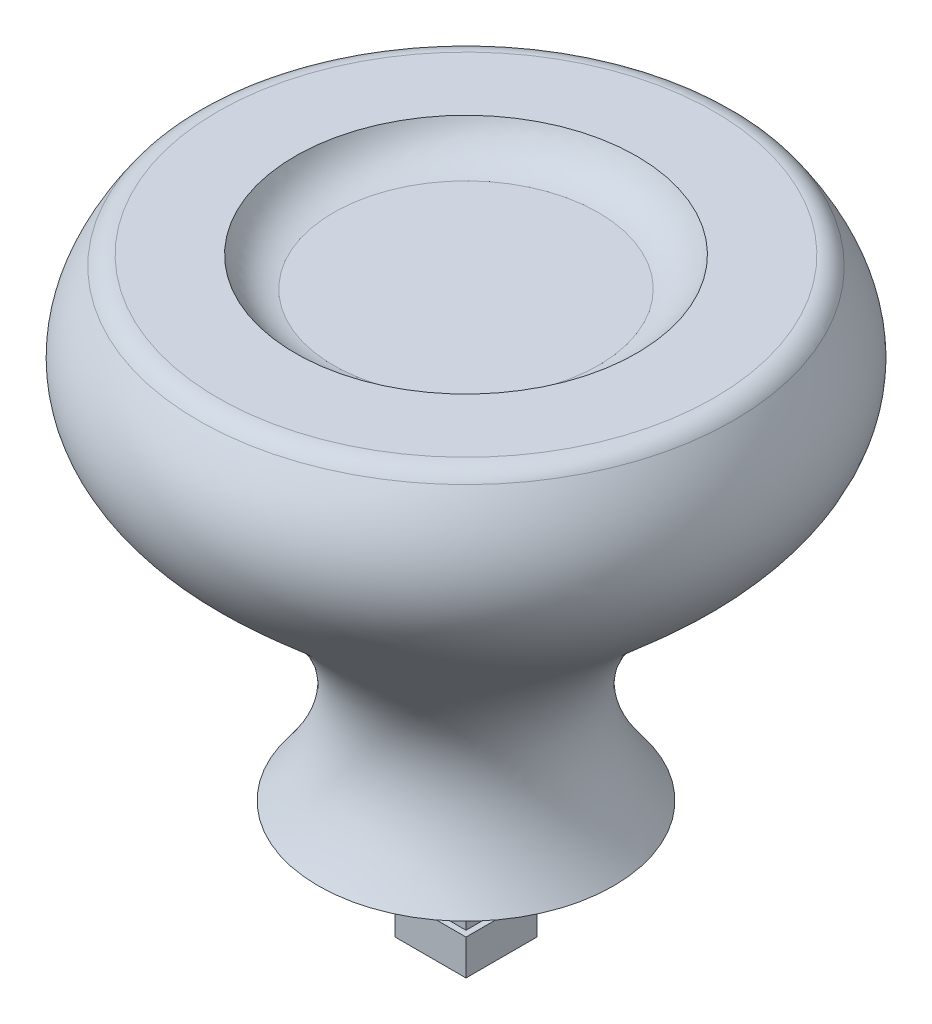
ISO-10303-21;
HEADER;
FILE_DESCRIPTION(('STEP AP214'),'2;1');
FILE_NAME('part.step','',(''),(''),'','','');
FILE_SCHEMA(('AUTOMOTIVE_DESIGN { 1 0 10303 214 1 1 1 1 }'));
ENDSEC;
DATA;
#1=APPLICATION_CONTEXT('core data for automotive mechanical design processes');
#2=APPLICATION_PROTOCOL_DEFINITION('international standard','automotive_design',2000,#1);
#3=PRODUCT_CONTEXT('',#1,'mechanical');
#4=PRODUCT('Part','Part','',(#3));
#5=PRODUCT_RELATED_PRODUCT_CATEGORY('part','',(#4));
#6=PRODUCT_DEFINITION_FORMATION('','',#4);
#7=PRODUCT_DEFINITION_CONTEXT('part definition',#1,'design');
#8=PRODUCT_DEFINITION('design','',#6,#7);
#9=PRODUCT_DEFINITION_SHAPE('','',#8);
#10=(LENGTH_UNIT() NAMED_UNIT(*) SI_UNIT(.MILLI.,.METRE.));
#11=(NAMED_UNIT(*) PLANE_ANGLE_UNIT() SI_UNIT($,.RADIAN.));
#12=(NAMED_UNIT(*) SI_UNIT($,.STERADIAN.) SOLID_ANGLE_UNIT());
#13=UNCERTAINTY_MEASURE_WITH_UNIT(LENGTH_MEASURE(1.E-05),#10,'distance_accuracy_value','');
#14=(GEOMETRIC_REPRESENTATION_CONTEXT(3) GLOBAL_UNCERTAINTY_ASSIGNED_CONTEXT((#13)) GLOBAL_UNIT_ASSIGNED_CONTEXT((#10,
#11,#12)) REPRESENTATION_CONTEXT('',''));
#15=CARTESIAN_POINT('',(0.,0.,0.));
#16=DIRECTION('',(0.,0.,1.));
#17=DIRECTION('',(1.,0.,0.));
#18=AXIS2_PLACEMENT_3D('',#15,#16,#17);
#19=CARTESIAN_POINT('',(0.,0.,0.));
#20=DIRECTION('',(0.,-1.,0.));
#21=DIRECTION('',(1.,0.,0.));
#22=AXIS2_PLACEMENT_3D('',#19,#20,#21);
#23=PLANE('',#22);
#24=DIRECTION('',(0.,0.,1.));
#25=VECTOR('',#24,1.);
#26=CARTESIAN_POINT('',(2.5,0.,2.5));
#27=LINE('',#26,#25);
#28=CARTESIAN_POINT('',(2.5,0.,-2.5));
#29=VERTEX_POINT('',#28);
#30=CARTESIAN_POINT('',(2.5,0.,2.5));
#31=VERTEX_POINT('',#30);
#32=EDGE_CURVE('E175',#29,#31,#27,.T.);
#33=ORIENTED_EDGE('',*,*,#32,.F.);
#34=DIRECTION('',(1.,0.,0.));
#35=VECTOR('',#34,1.);
#36=CARTESIAN_POINT('',(-2.5,0.,-2.5));
#37=LINE('',#36,#35);
#38=CARTESIAN_POINT('',(-2.5,0.,-2.5));
#39=VERTEX_POINT('',#38);
#40=EDGE_CURVE('E186',#39,#29,#37,.T.);
#41=ORIENTED_EDGE('',*,*,#40,.F.);
#42=DIRECTION('',(0.,0.,-1.));
#43=VECTOR('',#42,1.);
#44=CARTESIAN_POINT('',(-2.5,0.,2.5));
#45=LINE('',#44,#43);
#46=CARTESIAN_POINT('',(-2.5,0.,2.5));
#47=VERTEX_POINT('',#46);
#48=EDGE_CURVE('E182',#47,#39,#45,.T.);
#49=ORIENTED_EDGE('',*,*,#48,.F.);
#50=DIRECTION('',(-1.,0.,0.));
#51=VECTOR('',#50,1.);
#52=CARTESIAN_POINT('',(-2.5,0.,2.5));
#53=LINE('',#52,#51);
#54=EDGE_CURVE('E178',#31,#47,#53,.T.);
#55=ORIENTED_EDGE('',*,*,#54,.F.);
#56=EDGE_LOOP('',(#33,#41,#49,#55));
#57=FACE_BOUND('',#56,.T.);
#58=CARTESIAN_POINT('',(0.,0.,0.));
#59=DIRECTION('',(0.,-1.,0.));
#60=DIRECTION('',(1.,0.,0.));
#61=AXIS2_PLACEMENT_3D('',#58,#59,#60);
#62=CIRCLE('',#61,12.5);
#63=CARTESIAN_POINT('',(12.5,0.,0.));
#64=VERTEX_POINT('',#63);
#65=EDGE_CURVE('E231',#64,#64,#62,.T.);
#66=ORIENTED_EDGE('',*,*,#65,.T.);
#67=EDGE_LOOP('',(#66));
#68=FACE_BOUND('',#67,.T.);
#69=ADVANCED_FACE('F45',(#57,#68),#23,.T.);
#70=CARTESIAN_POINT('',(12.5,0.,0.));
#71=CARTESIAN_POINT('',(-2.79299913125608,19.4776406927146,0.));
#72=CARTESIAN_POINT('',(36.0481940970209,21.9036233326718,0.));
#73=CARTESIAN_POINT('',(22.,40.,0.));
#74=B_SPLINE_CURVE_WITH_KNOTS('',3,(#70,#71,#72,#73),.UNSPECIFIED.,.F.,.F.,(4,4),(0.,1.),.UNSPECIFIED.);
#75=CARTESIAN_POINT('',(0.,0.,0.));
#76=DIRECTION('',(0.,-1.,0.));
#77=AXIS1_PLACEMENT('',#75,#76);
#78=SURFACE_OF_REVOLUTION('',#74,#77);
#79=CARTESIAN_POINT('',(0.,39.1514987910332,0.));
#80=DIRECTION('',(0.,-1.,0.));
#81=DIRECTION('',(1.,0.,0.));
#82=AXIS2_PLACEMENT_3D('',#79,#80,#81);
#83=CIRCLE('',#82,22.6283444466604);
#84=CARTESIAN_POINT('',(22.6283444466604,39.1514987910332,0.));
#85=VERTEX_POINT('',#84);
#86=EDGE_CURVE('E238',#85,#85,#83,.T.);
#87=ORIENTED_EDGE('',*,*,#86,.T.);
#88=EDGE_LOOP('',(#87));
#89=FACE_BOUND('',#88,.T.);
#90=ORIENTED_EDGE('',*,*,#65,.F.);
#91=EDGE_LOOP('',(#90));
#92=FACE_BOUND('',#91,.T.);
#93=ADVANCED_FACE('F221',(#89,#92),#78,.F.);
#94=CARTESIAN_POINT('',(0.,40.,0.));
#95=DIRECTION('',(0.,1.,0.));
#96=DIRECTION('',(-1.,0.,0.));
#97=AXIS2_PLACEMENT_3D('',#94,#95,#96);
#98=PLANE('',#97);
#99=CARTESIAN_POINT('',(0.,40.,0.));
#100=DIRECTION('',(0.,1.,0.));
#101=DIRECTION('',(-1.,0.,0.));
#102=AXIS2_PLACEMENT_3D('',#99,#100,#101);
#103=CIRCLE('',#102,20.9930920091912);
#104=CARTESIAN_POINT('',(-20.9930920091912,40.,0.));
#105=VERTEX_POINT('',#104);
#106=EDGE_CURVE('E54',#105,#105,#103,.T.);
#107=ORIENTED_EDGE('',*,*,#106,.T.);
#108=EDGE_LOOP('',(#107));
#109=FACE_BOUND('',#108,.T.);
#110=CARTESIAN_POINT('',(0.,40.,0.));
#111=DIRECTION('',(0.,-1.,0.));
#112=DIRECTION('',(0.,0.,-1.));
#113=AXIS2_PLACEMENT_3D('',#110,#111,#112);
#114=CIRCLE('',#113,14.4470281404104);
#115=CARTESIAN_POINT('',(0.,40.,-14.4470281404104));
#116=VERTEX_POINT('',#115);
#117=EDGE_CURVE('E230',#116,#116,#114,.T.);
#118=ORIENTED_EDGE('',*,*,#117,.T.);
#119=EDGE_LOOP('',(#118));
#120=FACE_BOUND('',#119,.T.);
#121=ADVANCED_FACE('F216',(#109,#120),#98,.T.);
#122=CARTESIAN_POINT('',(-14.4470281404104,40.,0.));
#123=CARTESIAN_POINT('',(-13.4765907851666,37.8769115757183,0.));
#124=CARTESIAN_POINT('',(-11.2044085978734,37.4869839615388,0.));
#125=B_SPLINE_CURVE_WITH_KNOTS('',2,(#122,#123,#124),.UNSPECIFIED.,.F.,.F.,(3,3),(0.,1.),.UNSPECIFIED.);
#126=CARTESIAN_POINT('',(0.,-3.04576032017368,0.));
#127=DIRECTION('',(0.,-1.,0.));
#128=AXIS1_PLACEMENT('',#126,#127);
#129=SURFACE_OF_REVOLUTION('',#125,#128);
#130=CARTESIAN_POINT('',(0.,37.4869839615388,0.));
#131=DIRECTION('',(0.,-1.,0.));
#132=DIRECTION('',(0.,0.,-1.));
#133=AXIS2_PLACEMENT_3D('',#130,#131,#132);
#134=CIRCLE('',#133,11.2044085978734);
#135=CARTESIAN_POINT('',(0.,37.4869839615388,-11.2044085978734));
#136=VERTEX_POINT('',#135);
#137=EDGE_CURVE('E201',#136,#136,#134,.T.);
#138=ORIENTED_EDGE('',*,*,#137,.T.);
#139=EDGE_LOOP('',(#138));
#140=FACE_BOUND('',#139,.T.);
#141=ORIENTED_EDGE('',*,*,#117,.F.);
#142=EDGE_LOOP('',(#141));
#143=FACE_BOUND('',#142,.T.);
#144=ADVANCED_FACE('F211',(#140,#143),#129,.F.);
#145=CARTESIAN_POINT('',(0.,37.4869839615388,0.));
#146=DIRECTION('',(0.,1.,0.));
#147=DIRECTION('',(0.,0.,1.));
#148=AXIS2_PLACEMENT_3D('',#145,#146,#147);
#149=PLANE('',#148);
#150=ORIENTED_EDGE('',*,*,#137,.F.);
#151=EDGE_LOOP('',(#150));
#152=FACE_BOUND('',#151,.T.);
#153=ADVANCED_FACE('F215',(#152),#149,.T.);
#154=CARTESIAN_POINT('',(0.,38.,0.));
#155=DIRECTION('',(0.,-1.,0.));
#156=DIRECTION('',(1.,0.,0.));
#157=AXIS2_PLACEMENT_3D('',#154,#155,#156);
#158=TOROIDAL_SURFACE('',#157,20.9930920091912,2.);
#159=ORIENTED_EDGE('',*,*,#106,.F.);
#160=EDGE_LOOP('',(#159));
#161=FACE_BOUND('',#160,.T.);
#162=ORIENTED_EDGE('',*,*,#86,.F.);
#163=EDGE_LOOP('',(#162));
#164=FACE_BOUND('',#163,.T.);
#165=ADVANCED_FACE('F47',(#161,#164),#158,.T.);
#166=CARTESIAN_POINT('',(2.5,-10.,2.5));
#167=DIRECTION('',(-1.,0.,0.));
#168=DIRECTION('',(0.,-1.,0.));
#169=AXIS2_PLACEMENT_3D('',#166,#167,#168);
#170=PLANE('',#169);
#171=DIRECTION('',(0.,1.,0.));
#172=VECTOR('',#171,1.);
#173=CARTESIAN_POINT('',(2.5,-10.,2.5));
#174=LINE('',#173,#172);
#175=CARTESIAN_POINT('',(2.5,-7.,2.5));
#176=VERTEX_POINT('',#175);
#177=EDGE_CURVE('E198',#176,#31,#174,.T.);
#178=ORIENTED_EDGE('',*,*,#177,.F.);
#179=DIRECTION('',(0.,0.,-1.));
#180=VECTOR('',#179,1.);
#181=CARTESIAN_POINT('',(2.5,-7.,2.5));
#182=LINE('',#181,#180);
#183=CARTESIAN_POINT('',(2.5,-7.,-2.5));
#184=VERTEX_POINT('',#183);
#185=EDGE_CURVE('E172',#176,#184,#182,.T.);
#186=ORIENTED_EDGE('',*,*,#185,.T.);
#187=DIRECTION('',(0.,1.,0.));
#188=VECTOR('',#187,1.);
#189=CARTESIAN_POINT('',(2.5,-10.,-2.5));
#190=LINE('',#189,#188);
#191=EDGE_CURVE('E68',#184,#29,#190,.T.);
#192=ORIENTED_EDGE('',*,*,#191,.T.);
#193=ORIENTED_EDGE('',*,*,#32,.T.);
#194=EDGE_LOOP('',(#178,#186,#192,#193));
#195=FACE_BOUND('',#194,.T.);
#196=ADVANCED_FACE('F248',(#195),#170,.F.);
#197=CARTESIAN_POINT('',(-2.5,-10.,2.5));
#198=DIRECTION('',(0.,0.,-1.));
#199=DIRECTION('',(-1.,0.,0.));
#200=AXIS2_PLACEMENT_3D('',#197,#198,#199);
#201=PLANE('',#200);
#202=DIRECTION('',(0.,1.,0.));
#203=VECTOR('',#202,1.);
#204=CARTESIAN_POINT('',(-2.5,-10.,2.5));
#205=LINE('',#204,#203);
#206=CARTESIAN_POINT('',(-2.5,-7.,2.5));
#207=VERTEX_POINT('',#206);
#208=EDGE_CURVE('E195',#207,#47,#205,.T.);
#209=ORIENTED_EDGE('',*,*,#208,.F.);
#210=DIRECTION('',(1.,0.,0.));
#211=VECTOR('',#210,1.);
#212=CARTESIAN_POINT('',(-2.5,-7.,2.5));
#213=LINE('',#212,#211);
#214=EDGE_CURVE('E168',#207,#176,#213,.T.);
#215=ORIENTED_EDGE('',*,*,#214,.T.);
#216=ORIENTED_EDGE('',*,*,#177,.T.);
#217=ORIENTED_EDGE('',*,*,#54,.T.);
#218=EDGE_LOOP('',(#209,#215,#216,#217));
#219=FACE_BOUND('',#218,.T.);
#220=ADVANCED_FACE('F269',(#219),#201,.F.);
#221=CARTESIAN_POINT('',(-2.5,-10.,2.5));
#222=DIRECTION('',(1.,0.,0.));
#223=DIRECTION('',(0.,1.,0.));
#224=AXIS2_PLACEMENT_3D('',#221,#222,#223);
#225=PLANE('',#224);
#226=DIRECTION('',(0.,1.,0.));
#227=VECTOR('',#226,1.);
#228=CARTESIAN_POINT('',(-2.5,-10.,-2.5));
#229=LINE('',#228,#227);
#230=CARTESIAN_POINT('',(-2.5,-7.,-2.5));
#231=VERTEX_POINT('',#230);
#232=EDGE_CURVE('E192',#231,#39,#229,.T.);
#233=ORIENTED_EDGE('',*,*,#232,.F.);
#234=DIRECTION('',(0.,0.,1.));
#235=VECTOR('',#234,1.);
#236=CARTESIAN_POINT('',(-2.5,-7.,2.5));
#237=LINE('',#236,#235);
#238=EDGE_CURVE('E61',#231,#207,#237,.T.);
#239=ORIENTED_EDGE('',*,*,#238,.T.);
#240=ORIENTED_EDGE('',*,*,#208,.T.);
#241=ORIENTED_EDGE('',*,*,#48,.T.);
#242=EDGE_LOOP('',(#233,#239,#240,#241));
#243=FACE_BOUND('',#242,.T.);
#244=ADVANCED_FACE('F266',(#243),#225,.F.);
#245=CARTESIAN_POINT('',(-2.5,-10.,-2.5));
#246=DIRECTION('',(0.,0.,1.));
#247=DIRECTION('',(1.,0.,0.));
#248=AXIS2_PLACEMENT_3D('',#245,#246,#247);
#249=PLANE('',#248);
#250=ORIENTED_EDGE('',*,*,#191,.F.);
#251=DIRECTION('',(-1.,0.,0.));
#252=VECTOR('',#251,1.);
#253=CARTESIAN_POINT('',(-2.5,-7.,-2.5));
#254=LINE('',#253,#252);
#255=EDGE_CURVE('E11',#184,#231,#254,.T.);
#256=ORIENTED_EDGE('',*,*,#255,.T.);
#257=ORIENTED_EDGE('',*,*,#232,.T.);
#258=ORIENTED_EDGE('',*,*,#40,.T.);
#259=EDGE_LOOP('',(#250,#256,#257,#258));
#260=FACE_BOUND('',#259,.T.);
#261=ADVANCED_FACE('F263',(#260),#249,.F.);
#262=CARTESIAN_POINT('',(0.,-7.,0.));
#263=DIRECTION('',(0.,1.,0.));
#264=DIRECTION('',(0.,0.,1.));
#265=AXIS2_PLACEMENT_3D('',#262,#263,#264);
#266=PLANE('',#265);
#267=DIRECTION('',(0.,0.,1.));
#268=VECTOR('',#267,1.);
#269=CARTESIAN_POINT('',(3.,-7.,-3.));
#270=LINE('',#269,#268);
#271=CARTESIAN_POINT('',(3.,-7.,-3.));
#272=VERTEX_POINT('',#271);
#273=CARTESIAN_POINT('',(3.,-7.,3.));
#274=VERTEX_POINT('',#273);
#275=EDGE_CURVE('E131',#272,#274,#270,.T.);
#276=ORIENTED_EDGE('',*,*,#275,.F.);
#277=DIRECTION('',(1.,0.,0.));
#278=VECTOR('',#277,1.);
#279=CARTESIAN_POINT('',(-3.,-7.,-3.));
#280=LINE('',#279,#278);
#281=CARTESIAN_POINT('',(-3.,-7.,-3.));
#282=VERTEX_POINT('',#281);
#283=EDGE_CURVE('E124',#282,#272,#280,.T.);
#284=ORIENTED_EDGE('',*,*,#283,.F.);
#285=DIRECTION('',(0.,0.,-1.));
#286=VECTOR('',#285,1.);
#287=CARTESIAN_POINT('',(-3.,-7.,-3.));
#288=LINE('',#287,#286);
#289=CARTESIAN_POINT('',(-3.,-7.,3.));
#290=VERTEX_POINT('',#289);
#291=EDGE_CURVE('E134',#290,#282,#288,.T.);
#292=ORIENTED_EDGE('',*,*,#291,.F.);
#293=DIRECTION('',(-1.,0.,0.));
#294=VECTOR('',#293,1.);
#295=CARTESIAN_POINT('',(-3.,-7.,3.));
#296=LINE('',#295,#294);
#297=EDGE_CURVE('E115',#274,#290,#296,.T.);
#298=ORIENTED_EDGE('',*,*,#297,.F.);
#299=EDGE_LOOP('',(#276,#284,#292,#298));
#300=FACE_BOUND('',#299,.T.);
#301=ORIENTED_EDGE('',*,*,#185,.F.);
#302=ORIENTED_EDGE('',*,*,#214,.F.);
#303=ORIENTED_EDGE('',*,*,#238,.F.);
#304=ORIENTED_EDGE('',*,*,#255,.F.);
#305=EDGE_LOOP('',(#301,#302,#303,#304));
#306=FACE_BOUND('',#305,.T.);
#307=ADVANCED_FACE('F129',(#300,#306),#266,.T.);
#308=CARTESIAN_POINT('',(3.,-7.,-3.));
#309=DIRECTION('',(1.,0.,0.));
#310=DIRECTION('',(0.,1.,0.));
#311=AXIS2_PLACEMENT_3D('',#308,#309,#310);
#312=PLANE('',#311);
#313=DIRECTION('',(0.,0.,1.));
#314=VECTOR('',#313,1.);
#315=CARTESIAN_POINT('',(3.,-10.,-3.));
#316=LINE('',#315,#314);
#317=CARTESIAN_POINT('',(3.,-10.,-3.));
#318=VERTEX_POINT('',#317);
#319=CARTESIAN_POINT('',(3.,-10.,3.));
#320=VERTEX_POINT('',#319);
#321=EDGE_CURVE('E151',#318,#320,#316,.T.);
#322=ORIENTED_EDGE('',*,*,#321,.F.);
#323=DIRECTION('',(0.,-1.,0.));
#324=VECTOR('',#323,1.);
#325=CARTESIAN_POINT('',(3.,-7.,-3.));
#326=LINE('',#325,#324);
#327=EDGE_CURVE('E138',#272,#318,#326,.T.);
#328=ORIENTED_EDGE('',*,*,#327,.F.);
#329=ORIENTED_EDGE('',*,*,#275,.T.);
#330=DIRECTION('',(0.,-1.,0.));
#331=VECTOR('',#330,1.);
#332=CARTESIAN_POINT('',(3.,-7.,3.));
#333=LINE('',#332,#331);
#334=EDGE_CURVE('E112',#274,#320,#333,.T.);
#335=ORIENTED_EDGE('',*,*,#334,.T.);
#336=EDGE_LOOP('',(#322,#328,#329,#335));
#337=FACE_BOUND('',#336,.T.);
#338=ADVANCED_FACE('F137',(#337),#312,.T.);
#339=CARTESIAN_POINT('',(-3.,-7.,-3.));
#340=DIRECTION('',(0.,0.,-1.));
#341=DIRECTION('',(-1.,0.,0.));
#342=AXIS2_PLACEMENT_3D('',#339,#340,#341);
#343=PLANE('',#342);
#344=DIRECTION('',(1.,0.,0.));
#345=VECTOR('',#344,1.);
#346=CARTESIAN_POINT('',(-3.,-10.,-3.));
#347=LINE('',#346,#345);
#348=CARTESIAN_POINT('',(-3.,-10.,-3.));
#349=VERTEX_POINT('',#348);
#350=EDGE_CURVE('E140',#349,#318,#347,.T.);
#351=ORIENTED_EDGE('',*,*,#350,.F.);
#352=DIRECTION('',(0.,-1.,0.));
#353=VECTOR('',#352,1.);
#354=CARTESIAN_POINT('',(-3.,-7.,-3.));
#355=LINE('',#354,#353);
#356=EDGE_CURVE('E161',#282,#349,#355,.T.);
#357=ORIENTED_EDGE('',*,*,#356,.F.);
#358=ORIENTED_EDGE('',*,*,#283,.T.);
#359=ORIENTED_EDGE('',*,*,#327,.T.);
#360=EDGE_LOOP('',(#351,#357,#358,#359));
#361=FACE_BOUND('',#360,.T.);
#362=ADVANCED_FACE('F276',(#361),#343,.T.);
#363=CARTESIAN_POINT('',(-3.,-7.,-3.));
#364=DIRECTION('',(-1.,0.,0.));
#365=DIRECTION('',(0.,-1.,0.));
#366=AXIS2_PLACEMENT_3D('',#363,#364,#365);
#367=PLANE('',#366);
#368=DIRECTION('',(0.,0.,-1.));
#369=VECTOR('',#368,1.);
#370=CARTESIAN_POINT('',(-3.,-10.,-3.));
#371=LINE('',#370,#369);
#372=CARTESIAN_POINT('',(-3.,-10.,3.));
#373=VERTEX_POINT('',#372);
#374=EDGE_CURVE('E144',#373,#349,#371,.T.);
#375=ORIENTED_EDGE('',*,*,#374,.F.);
#376=DIRECTION('',(0.,-1.,0.));
#377=VECTOR('',#376,1.);
#378=CARTESIAN_POINT('',(-3.,-7.,3.));
#379=LINE('',#378,#377);
#380=EDGE_CURVE('E123',#290,#373,#379,.T.);
#381=ORIENTED_EDGE('',*,*,#380,.F.);
#382=ORIENTED_EDGE('',*,*,#291,.T.);
#383=ORIENTED_EDGE('',*,*,#356,.T.);
#384=EDGE_LOOP('',(#375,#381,#382,#383));
#385=FACE_BOUND('',#384,.T.);
#386=ADVANCED_FACE('F282',(#385),#367,.T.);
#387=CARTESIAN_POINT('',(-3.,-7.,3.));
#388=DIRECTION('',(0.,0.,1.));
#389=DIRECTION('',(1.,0.,0.));
#390=AXIS2_PLACEMENT_3D('',#387,#388,#389);
#391=PLANE('',#390);
#392=DIRECTION('',(-1.,0.,0.));
#393=VECTOR('',#392,1.);
#394=CARTESIAN_POINT('',(-3.,-10.,3.));
#395=LINE('',#394,#393);
#396=EDGE_CURVE('E117',#320,#373,#395,.T.);
#397=ORIENTED_EDGE('',*,*,#396,.F.);
#398=ORIENTED_EDGE('',*,*,#334,.F.);
#399=ORIENTED_EDGE('',*,*,#297,.T.);
#400=ORIENTED_EDGE('',*,*,#380,.T.);
#401=EDGE_LOOP('',(#397,#398,#399,#400));
#402=FACE_BOUND('',#401,.T.);
#403=ADVANCED_FACE('F114',(#402),#391,.T.);
#404=CARTESIAN_POINT('',(0.,-10.,0.));
#405=DIRECTION('',(0.,-1.,0.));
#406=DIRECTION('',(1.,0.,0.));
#407=AXIS2_PLACEMENT_3D('',#404,#405,#406);
#408=PLANE('',#407);
#409=ORIENTED_EDGE('',*,*,#321,.T.);
#410=ORIENTED_EDGE('',*,*,#396,.T.);
#411=ORIENTED_EDGE('',*,*,#374,.T.);
#412=ORIENTED_EDGE('',*,*,#350,.T.);
#413=EDGE_LOOP('',(#409,#410,#411,#412));
#414=FACE_BOUND('',#413,.T.);
#415=ADVANCED_FACE('F288',(#414),#408,.T.);
#416=CLOSED_SHELL('',(#69,#93,#121,#144,#153,#165,#196,#220,#244,#261,#307,#338,#362,#386,#403,#415));
#417=MANIFOLD_SOLID_BREP('B2',#416);
#418=ADVANCED_BREP_SHAPE_REPRESENTATION('',(#18,#417),#14);
#419=SHAPE_DEFINITION_REPRESENTATION(#9,#418);
ENDSEC;
END-ISO-10303-21;
